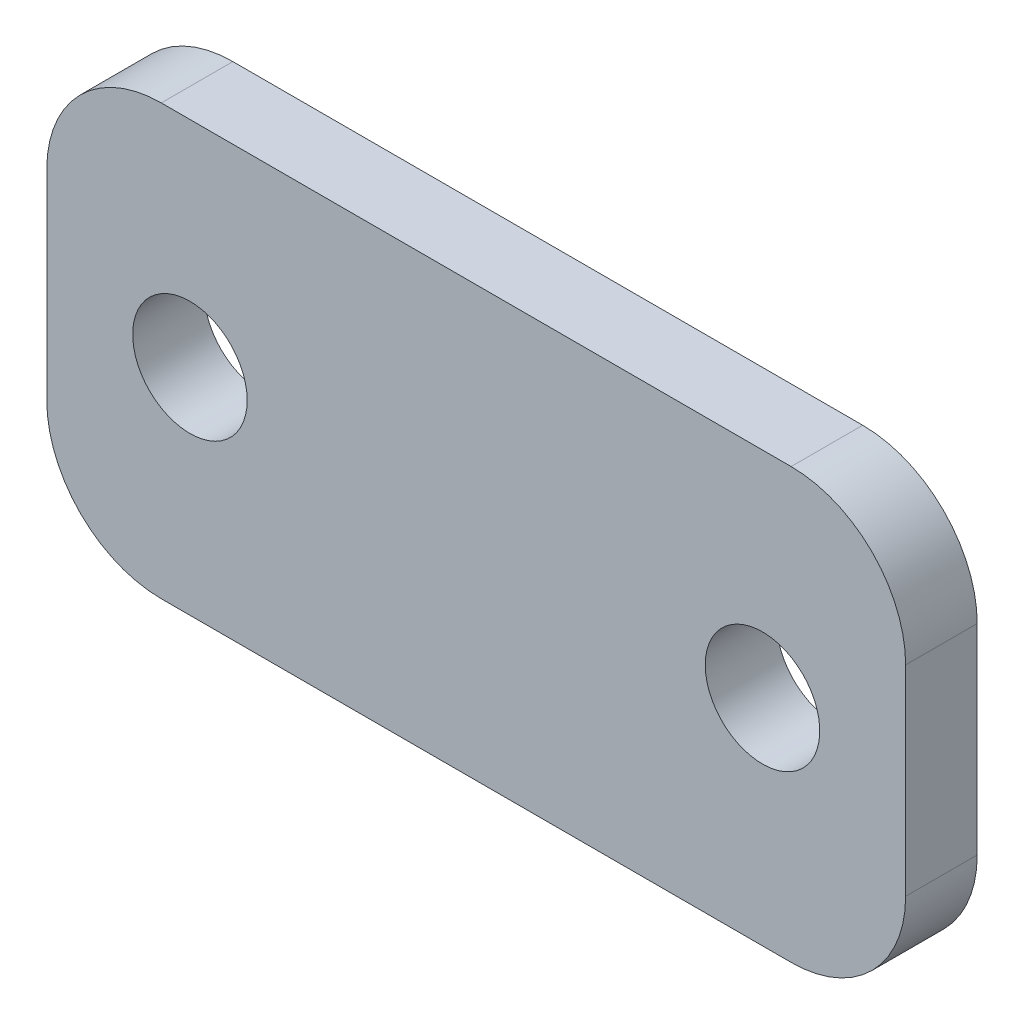
ISO-10303-21;
HEADER;
FILE_DESCRIPTION(('STEP AP214'),'2;1');
FILE_NAME('part.step','',(''),(''),'','','');
FILE_SCHEMA(('AUTOMOTIVE_DESIGN { 1 0 10303 214 1 1 1 1 }'));
ENDSEC;
DATA;
#1=APPLICATION_CONTEXT('core data for automotive mechanical design processes');
#2=APPLICATION_PROTOCOL_DEFINITION('international standard','automotive_design',2000,#1);
#3=PRODUCT_CONTEXT('',#1,'mechanical');
#4=PRODUCT('Part','Part','',(#3));
#5=PRODUCT_RELATED_PRODUCT_CATEGORY('part','',(#4));
#6=PRODUCT_DEFINITION_FORMATION('','',#4);
#7=PRODUCT_DEFINITION_CONTEXT('part definition',#1,'design');
#8=PRODUCT_DEFINITION('design','',#6,#7);
#9=PRODUCT_DEFINITION_SHAPE('','',#8);
#10=(LENGTH_UNIT() NAMED_UNIT(*) SI_UNIT(.MILLI.,.METRE.));
#11=(NAMED_UNIT(*) PLANE_ANGLE_UNIT() SI_UNIT($,.RADIAN.));
#12=(NAMED_UNIT(*) SI_UNIT($,.STERADIAN.) SOLID_ANGLE_UNIT());
#13=UNCERTAINTY_MEASURE_WITH_UNIT(LENGTH_MEASURE(1.E-05),#10,'distance_accuracy_value','');
#14=(GEOMETRIC_REPRESENTATION_CONTEXT(3) GLOBAL_UNCERTAINTY_ASSIGNED_CONTEXT((#13)) GLOBAL_UNIT_ASSIGNED_CONTEXT((#10,
#11,#12)) REPRESENTATION_CONTEXT('',''));
#15=CARTESIAN_POINT('',(0.,0.,0.));
#16=DIRECTION('',(0.,0.,1.));
#17=DIRECTION('',(1.,0.,0.));
#18=AXIS2_PLACEMENT_3D('',#15,#16,#17);
#19=CARTESIAN_POINT('',(-22.,-7.,5.));
#20=DIRECTION('',(0.,0.,-1.));
#21=DIRECTION('',(-1.,0.,0.));
#22=AXIS2_PLACEMENT_3D('',#19,#20,#21);
#23=PLANE('',#22);
#24=CARTESIAN_POINT('',(-22.,-7.,5.));
#25=DIRECTION('',(0.,0.,1.));
#26=DIRECTION('',(-1.,0.,0.));
#27=AXIS2_PLACEMENT_3D('',#24,#25,#26);
#28=CIRCLE('',#27,8.);
#29=CARTESIAN_POINT('',(-30.,-7.,5.));
#30=VERTEX_POINT('',#29);
#31=CARTESIAN_POINT('',(-22.,-15.,5.));
#32=VERTEX_POINT('',#31);
#33=EDGE_CURVE('E151',#30,#32,#28,.T.);
#34=ORIENTED_EDGE('',*,*,#33,.T.);
#35=DIRECTION('',(1.,0.,0.));
#36=VECTOR('',#35,1.);
#37=CARTESIAN_POINT('',(22.,-15.,5.));
#38=LINE('',#37,#36);
#39=CARTESIAN_POINT('',(22.,-15.,5.));
#40=VERTEX_POINT('',#39);
#41=EDGE_CURVE('E98',#32,#40,#38,.T.);
#42=ORIENTED_EDGE('',*,*,#41,.T.);
#43=CARTESIAN_POINT('',(22.,-7.,5.));
#44=DIRECTION('',(0.,0.,1.));
#45=DIRECTION('',(1.,0.,0.));
#46=AXIS2_PLACEMENT_3D('',#43,#44,#45);
#47=CIRCLE('',#46,8.);
#48=CARTESIAN_POINT('',(30.,-7.,5.));
#49=VERTEX_POINT('',#48);
#50=EDGE_CURVE('E168',#40,#49,#47,.T.);
#51=ORIENTED_EDGE('',*,*,#50,.T.);
#52=DIRECTION('',(0.,1.,0.));
#53=VECTOR('',#52,1.);
#54=CARTESIAN_POINT('',(30.,-6.99999999999994,5.));
#55=LINE('',#54,#53);
#56=CARTESIAN_POINT('',(30.,6.99999999999995,5.));
#57=VERTEX_POINT('',#56);
#58=EDGE_CURVE('E177',#49,#57,#55,.T.);
#59=ORIENTED_EDGE('',*,*,#58,.T.);
#60=CARTESIAN_POINT('',(22.,7.,5.));
#61=DIRECTION('',(0.,0.,1.));
#62=DIRECTION('',(1.,0.,0.));
#63=AXIS2_PLACEMENT_3D('',#60,#61,#62);
#64=CIRCLE('',#63,8.);
#65=CARTESIAN_POINT('',(22.,15.,5.));
#66=VERTEX_POINT('',#65);
#67=EDGE_CURVE('E119',#57,#66,#64,.T.);
#68=ORIENTED_EDGE('',*,*,#67,.T.);
#69=DIRECTION('',(-1.,0.,0.));
#70=VECTOR('',#69,1.);
#71=CARTESIAN_POINT('',(22.,15.,5.));
#72=LINE('',#71,#70);
#73=CARTESIAN_POINT('',(-22.,15.,5.));
#74=VERTEX_POINT('',#73);
#75=EDGE_CURVE('E115',#66,#74,#72,.T.);
#76=ORIENTED_EDGE('',*,*,#75,.T.);
#77=CARTESIAN_POINT('',(-22.,7.,5.));
#78=DIRECTION('',(0.,0.,1.));
#79=DIRECTION('',(1.,0.,0.));
#80=AXIS2_PLACEMENT_3D('',#77,#78,#79);
#81=CIRCLE('',#80,8.);
#82=CARTESIAN_POINT('',(-30.,7.,5.));
#83=VERTEX_POINT('',#82);
#84=EDGE_CURVE('E116',#74,#83,#81,.T.);
#85=ORIENTED_EDGE('',*,*,#84,.T.);
#86=DIRECTION('',(0.,-1.,0.));
#87=VECTOR('',#86,1.);
#88=CARTESIAN_POINT('',(-30.,-7.,5.));
#89=LINE('',#88,#87);
#90=EDGE_CURVE('E57',#83,#30,#89,.T.);
#91=ORIENTED_EDGE('',*,*,#90,.T.);
#92=EDGE_LOOP('',(#34,#42,#51,#59,#68,#76,#85,#91));
#93=FACE_BOUND('',#92,.T.);
#94=CARTESIAN_POINT('',(-20.,0.,5.));
#95=DIRECTION('',(0.,0.,1.));
#96=DIRECTION('',(1.,0.,0.));
#97=AXIS2_PLACEMENT_3D('',#94,#95,#96);
#98=CIRCLE('',#97,4.);
#99=CARTESIAN_POINT('',(-16.,0.,5.));
#100=VERTEX_POINT('',#99);
#101=EDGE_CURVE('E139',#100,#100,#98,.T.);
#102=ORIENTED_EDGE('',*,*,#101,.F.);
#103=EDGE_LOOP('',(#102));
#104=FACE_BOUND('',#103,.T.);
#105=CARTESIAN_POINT('',(20.,0.,5.));
#106=DIRECTION('',(0.,0.,1.));
#107=DIRECTION('',(-1.,0.,0.));
#108=AXIS2_PLACEMENT_3D('',#105,#106,#107);
#109=CIRCLE('',#108,4.);
#110=CARTESIAN_POINT('',(16.,0.,5.));
#111=VERTEX_POINT('',#110);
#112=EDGE_CURVE('E187',#111,#111,#109,.T.);
#113=ORIENTED_EDGE('',*,*,#112,.F.);
#114=EDGE_LOOP('',(#113));
#115=FACE_BOUND('',#114,.T.);
#116=ADVANCED_FACE('F39',(#93,#104,#115),#23,.F.);
#117=CARTESIAN_POINT('',(-22.,-7.,0.));
#118=DIRECTION('',(0.,0.,-1.));
#119=DIRECTION('',(-1.,0.,0.));
#120=AXIS2_PLACEMENT_3D('',#117,#118,#119);
#121=PLANE('',#120);
#122=CARTESIAN_POINT('',(-20.,0.,0.));
#123=DIRECTION('',(0.,0.,1.));
#124=DIRECTION('',(1.,0.,0.));
#125=AXIS2_PLACEMENT_3D('',#122,#123,#124);
#126=CIRCLE('',#125,4.);
#127=CARTESIAN_POINT('',(-16.,0.,0.));
#128=VERTEX_POINT('',#127);
#129=EDGE_CURVE('E184',#128,#128,#126,.T.);
#130=ORIENTED_EDGE('',*,*,#129,.T.);
#131=EDGE_LOOP('',(#130));
#132=FACE_BOUND('',#131,.T.);
#133=CARTESIAN_POINT('',(-22.,-7.,0.));
#134=DIRECTION('',(0.,0.,1.));
#135=DIRECTION('',(-1.,0.,0.));
#136=AXIS2_PLACEMENT_3D('',#133,#134,#135);
#137=CIRCLE('',#136,8.);
#138=CARTESIAN_POINT('',(-30.,-7.,0.));
#139=VERTEX_POINT('',#138);
#140=CARTESIAN_POINT('',(-22.,-15.,0.));
#141=VERTEX_POINT('',#140);
#142=EDGE_CURVE('E136',#139,#141,#137,.T.);
#143=ORIENTED_EDGE('',*,*,#142,.F.);
#144=DIRECTION('',(0.,-1.,0.));
#145=VECTOR('',#144,1.);
#146=CARTESIAN_POINT('',(-30.,-7.,0.));
#147=LINE('',#146,#145);
#148=CARTESIAN_POINT('',(-30.,7.,0.));
#149=VERTEX_POINT('',#148);
#150=EDGE_CURVE('E91',#149,#139,#147,.T.);
#151=ORIENTED_EDGE('',*,*,#150,.F.);
#152=CARTESIAN_POINT('',(-22.,7.,0.));
#153=DIRECTION('',(0.,0.,1.));
#154=DIRECTION('',(1.,0.,0.));
#155=AXIS2_PLACEMENT_3D('',#152,#153,#154);
#156=CIRCLE('',#155,8.);
#157=CARTESIAN_POINT('',(-22.,15.,0.));
#158=VERTEX_POINT('',#157);
#159=EDGE_CURVE('E82',#158,#149,#156,.T.);
#160=ORIENTED_EDGE('',*,*,#159,.F.);
#161=DIRECTION('',(-1.,0.,0.));
#162=VECTOR('',#161,1.);
#163=CARTESIAN_POINT('',(22.,15.,0.));
#164=LINE('',#163,#162);
#165=CARTESIAN_POINT('',(22.,15.,0.));
#166=VERTEX_POINT('',#165);
#167=EDGE_CURVE('E128',#166,#158,#164,.T.);
#168=ORIENTED_EDGE('',*,*,#167,.F.);
#169=CARTESIAN_POINT('',(22.,7.,0.));
#170=DIRECTION('',(0.,0.,1.));
#171=DIRECTION('',(1.,0.,0.));
#172=AXIS2_PLACEMENT_3D('',#169,#170,#171);
#173=CIRCLE('',#172,8.);
#174=CARTESIAN_POINT('',(30.,6.99999999999995,0.));
#175=VERTEX_POINT('',#174);
#176=EDGE_CURVE('E147',#175,#166,#173,.T.);
#177=ORIENTED_EDGE('',*,*,#176,.F.);
#178=DIRECTION('',(0.,1.,0.));
#179=VECTOR('',#178,1.);
#180=CARTESIAN_POINT('',(30.,-6.99999999999994,0.));
#181=LINE('',#180,#179);
#182=CARTESIAN_POINT('',(30.,-7.,0.));
#183=VERTEX_POINT('',#182);
#184=EDGE_CURVE('E143',#183,#175,#181,.T.);
#185=ORIENTED_EDGE('',*,*,#184,.F.);
#186=CARTESIAN_POINT('',(22.,-7.,0.));
#187=DIRECTION('',(0.,0.,1.));
#188=DIRECTION('',(1.,0.,0.));
#189=AXIS2_PLACEMENT_3D('',#186,#187,#188);
#190=CIRCLE('',#189,8.);
#191=CARTESIAN_POINT('',(22.,-15.,0.));
#192=VERTEX_POINT('',#191);
#193=EDGE_CURVE('E145',#192,#183,#190,.T.);
#194=ORIENTED_EDGE('',*,*,#193,.F.);
#195=DIRECTION('',(1.,0.,0.));
#196=VECTOR('',#195,1.);
#197=CARTESIAN_POINT('',(22.,-15.,0.));
#198=LINE('',#197,#196);
#199=EDGE_CURVE('E137',#141,#192,#198,.T.);
#200=ORIENTED_EDGE('',*,*,#199,.F.);
#201=EDGE_LOOP('',(#143,#151,#160,#168,#177,#185,#194,#200));
#202=FACE_BOUND('',#201,.T.);
#203=CARTESIAN_POINT('',(20.,0.,0.));
#204=DIRECTION('',(0.,0.,1.));
#205=DIRECTION('',(-1.,0.,0.));
#206=AXIS2_PLACEMENT_3D('',#203,#204,#205);
#207=CIRCLE('',#206,4.);
#208=CARTESIAN_POINT('',(16.,0.,0.));
#209=VERTEX_POINT('',#208);
#210=EDGE_CURVE('E192',#209,#209,#207,.T.);
#211=ORIENTED_EDGE('',*,*,#210,.T.);
#212=EDGE_LOOP('',(#211));
#213=FACE_BOUND('',#212,.T.);
#214=ADVANCED_FACE('F169',(#132,#202,#213),#121,.T.);
#215=CARTESIAN_POINT('',(-22.,-7.,5.));
#216=DIRECTION('',(0.,0.,-1.));
#217=DIRECTION('',(-1.,0.,0.));
#218=AXIS2_PLACEMENT_3D('',#215,#216,#217);
#219=CYLINDRICAL_SURFACE('',#218,8.);
#220=ORIENTED_EDGE('',*,*,#142,.T.);
#221=DIRECTION('',(0.,0.,-1.));
#222=VECTOR('',#221,1.);
#223=CARTESIAN_POINT('',(-22.,-15.,5.));
#224=LINE('',#223,#222);
#225=EDGE_CURVE('E11',#32,#141,#224,.T.);
#226=ORIENTED_EDGE('',*,*,#225,.F.);
#227=ORIENTED_EDGE('',*,*,#33,.F.);
#228=DIRECTION('',(0.,0.,-1.));
#229=VECTOR('',#228,1.);
#230=CARTESIAN_POINT('',(-30.,-7.,5.));
#231=LINE('',#230,#229);
#232=EDGE_CURVE('E135',#30,#139,#231,.T.);
#233=ORIENTED_EDGE('',*,*,#232,.T.);
#234=EDGE_LOOP('',(#220,#226,#227,#233));
#235=FACE_BOUND('',#234,.T.);
#236=ADVANCED_FACE('F41',(#235),#219,.T.);
#237=CARTESIAN_POINT('',(22.,-15.,5.));
#238=DIRECTION('',(0.,1.,0.));
#239=DIRECTION('',(-1.,0.,0.));
#240=AXIS2_PLACEMENT_3D('',#237,#238,#239);
#241=PLANE('',#240);
#242=ORIENTED_EDGE('',*,*,#199,.T.);
#243=DIRECTION('',(0.,0.,-1.));
#244=VECTOR('',#243,1.);
#245=CARTESIAN_POINT('',(22.,-15.,5.));
#246=LINE('',#245,#244);
#247=EDGE_CURVE('E48',#40,#192,#246,.T.);
#248=ORIENTED_EDGE('',*,*,#247,.F.);
#249=ORIENTED_EDGE('',*,*,#41,.F.);
#250=ORIENTED_EDGE('',*,*,#225,.T.);
#251=EDGE_LOOP('',(#242,#248,#249,#250));
#252=FACE_BOUND('',#251,.T.);
#253=ADVANCED_FACE('F223',(#252),#241,.F.);
#254=CARTESIAN_POINT('',(22.,-7.,5.));
#255=DIRECTION('',(0.,0.,-1.));
#256=DIRECTION('',(-1.,0.,0.));
#257=AXIS2_PLACEMENT_3D('',#254,#255,#256);
#258=CYLINDRICAL_SURFACE('',#257,8.);
#259=ORIENTED_EDGE('',*,*,#193,.T.);
#260=DIRECTION('',(0.,0.,-1.));
#261=VECTOR('',#260,1.);
#262=CARTESIAN_POINT('',(30.,-7.,5.));
#263=LINE('',#262,#261);
#264=EDGE_CURVE('E156',#49,#183,#263,.T.);
#265=ORIENTED_EDGE('',*,*,#264,.F.);
#266=ORIENTED_EDGE('',*,*,#50,.F.);
#267=ORIENTED_EDGE('',*,*,#247,.T.);
#268=EDGE_LOOP('',(#259,#265,#266,#267));
#269=FACE_BOUND('',#268,.T.);
#270=ADVANCED_FACE('F163',(#269),#258,.T.);
#271=CARTESIAN_POINT('',(30.,-6.99999999999994,5.));
#272=DIRECTION('',(-1.,0.,0.));
#273=DIRECTION('',(0.,0.,1.));
#274=AXIS2_PLACEMENT_3D('',#271,#272,#273);
#275=PLANE('',#274);
#276=ORIENTED_EDGE('',*,*,#184,.T.);
#277=DIRECTION('',(0.,0.,-1.));
#278=VECTOR('',#277,1.);
#279=CARTESIAN_POINT('',(30.,6.99999999999995,5.));
#280=LINE('',#279,#278);
#281=EDGE_CURVE('E155',#57,#175,#280,.T.);
#282=ORIENTED_EDGE('',*,*,#281,.F.);
#283=ORIENTED_EDGE('',*,*,#58,.F.);
#284=ORIENTED_EDGE('',*,*,#264,.T.);
#285=EDGE_LOOP('',(#276,#282,#283,#284));
#286=FACE_BOUND('',#285,.T.);
#287=ADVANCED_FACE('F172',(#286),#275,.F.);
#288=CARTESIAN_POINT('',(22.,7.,5.));
#289=DIRECTION('',(0.,0.,-1.));
#290=DIRECTION('',(-1.,0.,0.));
#291=AXIS2_PLACEMENT_3D('',#288,#289,#290);
#292=CYLINDRICAL_SURFACE('',#291,8.);
#293=ORIENTED_EDGE('',*,*,#176,.T.);
#294=DIRECTION('',(0.,0.,-1.));
#295=VECTOR('',#294,1.);
#296=CARTESIAN_POINT('',(22.,15.,5.));
#297=LINE('',#296,#295);
#298=EDGE_CURVE('E130',#66,#166,#297,.T.);
#299=ORIENTED_EDGE('',*,*,#298,.F.);
#300=ORIENTED_EDGE('',*,*,#67,.F.);
#301=ORIENTED_EDGE('',*,*,#281,.T.);
#302=EDGE_LOOP('',(#293,#299,#300,#301));
#303=FACE_BOUND('',#302,.T.);
#304=ADVANCED_FACE('F178',(#303),#292,.T.);
#305=CARTESIAN_POINT('',(22.,15.,5.));
#306=DIRECTION('',(0.,-1.,0.));
#307=DIRECTION('',(1.,0.,0.));
#308=AXIS2_PLACEMENT_3D('',#305,#306,#307);
#309=PLANE('',#308);
#310=ORIENTED_EDGE('',*,*,#167,.T.);
#311=DIRECTION('',(0.,0.,-1.));
#312=VECTOR('',#311,1.);
#313=CARTESIAN_POINT('',(-22.,15.,5.));
#314=LINE('',#313,#312);
#315=EDGE_CURVE('E121',#74,#158,#314,.T.);
#316=ORIENTED_EDGE('',*,*,#315,.F.);
#317=ORIENTED_EDGE('',*,*,#75,.F.);
#318=ORIENTED_EDGE('',*,*,#298,.T.);
#319=EDGE_LOOP('',(#310,#316,#317,#318));
#320=FACE_BOUND('',#319,.T.);
#321=ADVANCED_FACE('F125',(#320),#309,.F.);
#322=CARTESIAN_POINT('',(-22.,7.,5.));
#323=DIRECTION('',(0.,0.,-1.));
#324=DIRECTION('',(-1.,0.,0.));
#325=AXIS2_PLACEMENT_3D('',#322,#323,#324);
#326=CYLINDRICAL_SURFACE('',#325,8.);
#327=ORIENTED_EDGE('',*,*,#159,.T.);
#328=DIRECTION('',(0.,0.,-1.));
#329=VECTOR('',#328,1.);
#330=CARTESIAN_POINT('',(-30.,7.,5.));
#331=LINE('',#330,#329);
#332=EDGE_CURVE('E126',#83,#149,#331,.T.);
#333=ORIENTED_EDGE('',*,*,#332,.F.);
#334=ORIENTED_EDGE('',*,*,#84,.F.);
#335=ORIENTED_EDGE('',*,*,#315,.T.);
#336=EDGE_LOOP('',(#327,#333,#334,#335));
#337=FACE_BOUND('',#336,.T.);
#338=ADVANCED_FACE('F127',(#337),#326,.T.);
#339=CARTESIAN_POINT('',(-30.,-7.,5.));
#340=DIRECTION('',(1.,0.,0.));
#341=DIRECTION('',(0.,1.,0.));
#342=AXIS2_PLACEMENT_3D('',#339,#340,#341);
#343=PLANE('',#342);
#344=ORIENTED_EDGE('',*,*,#150,.T.);
#345=ORIENTED_EDGE('',*,*,#232,.F.);
#346=ORIENTED_EDGE('',*,*,#90,.F.);
#347=ORIENTED_EDGE('',*,*,#332,.T.);
#348=EDGE_LOOP('',(#344,#345,#346,#347));
#349=FACE_BOUND('',#348,.T.);
#350=ADVANCED_FACE('F213',(#349),#343,.F.);
#351=CARTESIAN_POINT('',(-20.,0.,5.));
#352=DIRECTION('',(0.,0.,-1.));
#353=DIRECTION('',(-1.,0.,0.));
#354=AXIS2_PLACEMENT_3D('',#351,#352,#353);
#355=CYLINDRICAL_SURFACE('',#354,4.);
#356=ORIENTED_EDGE('',*,*,#101,.T.);
#357=EDGE_LOOP('',(#356));
#358=FACE_BOUND('',#357,.T.);
#359=ORIENTED_EDGE('',*,*,#129,.F.);
#360=EDGE_LOOP('',(#359));
#361=FACE_BOUND('',#360,.T.);
#362=ADVANCED_FACE('F209',(#358,#361),#355,.F.);
#363=CARTESIAN_POINT('',(20.,0.,5.));
#364=DIRECTION('',(0.,0.,-1.));
#365=DIRECTION('',(-1.,0.,0.));
#366=AXIS2_PLACEMENT_3D('',#363,#364,#365);
#367=CYLINDRICAL_SURFACE('',#366,4.);
#368=ORIENTED_EDGE('',*,*,#112,.T.);
#369=EDGE_LOOP('',(#368));
#370=FACE_BOUND('',#369,.T.);
#371=ORIENTED_EDGE('',*,*,#210,.F.);
#372=EDGE_LOOP('',(#371));
#373=FACE_BOUND('',#372,.T.);
#374=ADVANCED_FACE('F197',(#370,#373),#367,.F.);
#375=CLOSED_SHELL('',(#116,#214,#236,#253,#270,#287,#304,#321,#338,#350,#362,#374));
#376=MANIFOLD_SOLID_BREP('B2',#375);
#377=ADVANCED_BREP_SHAPE_REPRESENTATION('',(#18,#376),#14);
#378=SHAPE_DEFINITION_REPRESENTATION(#9,#377);
ENDSEC;
END-ISO-10303-21;
